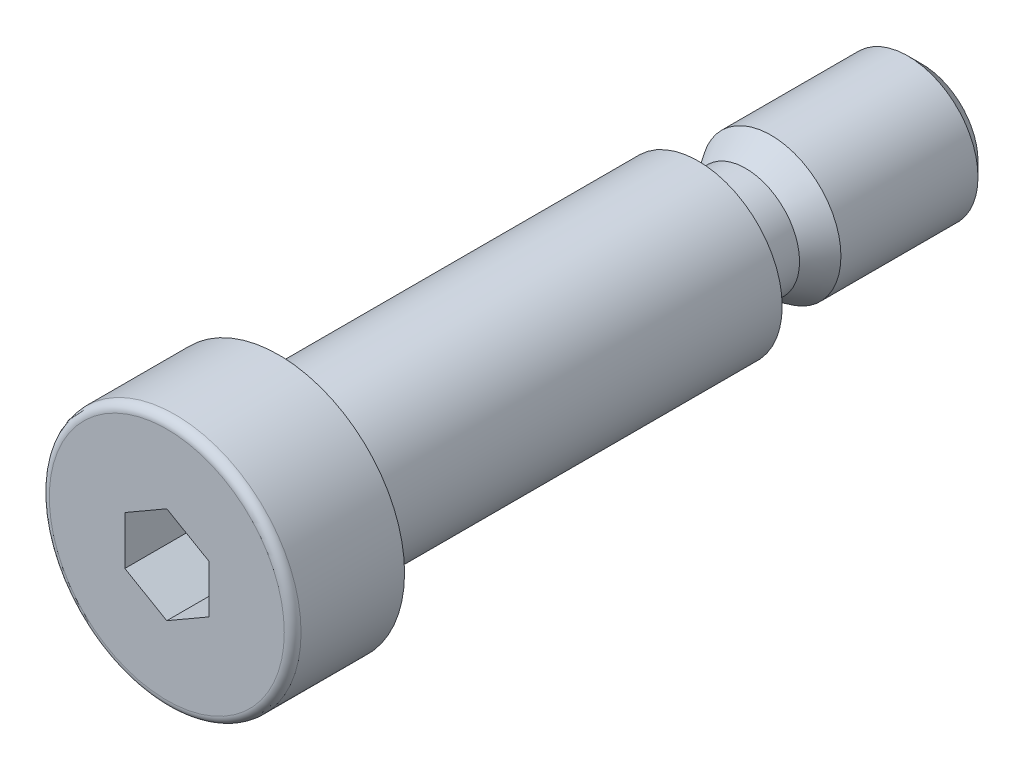
ISO-10303-21;
HEADER;
FILE_DESCRIPTION(('STEP AP214'),'2;1');
FILE_NAME('part.step','',(''),(''),'','','');
FILE_SCHEMA(('AUTOMOTIVE_DESIGN { 1 0 10303 214 1 1 1 1 }'));
ENDSEC;
DATA;
#1=APPLICATION_CONTEXT('core data for automotive mechanical design processes');
#2=APPLICATION_PROTOCOL_DEFINITION('international standard','automotive_design',2000,#1);
#3=PRODUCT_CONTEXT('',#1,'mechanical');
#4=PRODUCT('Part','Part','',(#3));
#5=PRODUCT_RELATED_PRODUCT_CATEGORY('part','',(#4));
#6=PRODUCT_DEFINITION_FORMATION('','',#4);
#7=PRODUCT_DEFINITION_CONTEXT('part definition',#1,'design');
#8=PRODUCT_DEFINITION('design','',#6,#7);
#9=PRODUCT_DEFINITION_SHAPE('','',#8);
#10=(LENGTH_UNIT() NAMED_UNIT(*) SI_UNIT(.MILLI.,.METRE.));
#11=(NAMED_UNIT(*) PLANE_ANGLE_UNIT() SI_UNIT($,.RADIAN.));
#12=(NAMED_UNIT(*) SI_UNIT($,.STERADIAN.) SOLID_ANGLE_UNIT());
#13=UNCERTAINTY_MEASURE_WITH_UNIT(LENGTH_MEASURE(1.E-05),#10,'distance_accuracy_value','');
#14=(GEOMETRIC_REPRESENTATION_CONTEXT(3) GLOBAL_UNCERTAINTY_ASSIGNED_CONTEXT((#13)) GLOBAL_UNIT_ASSIGNED_CONTEXT((#10,
#11,#12)) REPRESENTATION_CONTEXT('',''));
#15=CARTESIAN_POINT('',(0.,0.,0.));
#16=DIRECTION('',(0.,0.,1.));
#17=DIRECTION('',(1.,0.,0.));
#18=AXIS2_PLACEMENT_3D('',#15,#16,#17);
#19=CARTESIAN_POINT('',(0.,0.,23.));
#20=DIRECTION('',(0.,0.,1.));
#21=DIRECTION('',(1.,0.,0.));
#22=AXIS2_PLACEMENT_3D('',#19,#20,#21);
#23=PLANE('',#22);
#24=CARTESIAN_POINT('',(0.,0.,23.));
#25=DIRECTION('',(0.,0.,1.));
#26=DIRECTION('',(1.,0.,0.));
#27=AXIS2_PLACEMENT_3D('',#24,#25,#26);
#28=CIRCLE('',#27,8.4);
#29=CARTESIAN_POINT('',(8.4,0.,23.));
#30=VERTEX_POINT('',#29);
#31=EDGE_CURVE('E42',#30,#30,#28,.T.);
#32=ORIENTED_EDGE('',*,*,#31,.T.);
#33=EDGE_LOOP('',(#32));
#34=FACE_BOUND('',#33,.T.);
#35=DIRECTION('',(0.,1.,0.));
#36=VECTOR('',#35,1.);
#37=CARTESIAN_POINT('',(3.,-1.73205080756888,23.));
#38=LINE('',#37,#36);
#39=CARTESIAN_POINT('',(3.,-1.73205080756888,23.));
#40=VERTEX_POINT('',#39);
#41=CARTESIAN_POINT('',(3.,1.73205080756888,23.));
#42=VERTEX_POINT('',#41);
#43=EDGE_CURVE('E49',#40,#42,#38,.T.);
#44=ORIENTED_EDGE('',*,*,#43,.F.);
#45=DIRECTION('',(0.866025403784439,0.5,0.));
#46=VECTOR('',#45,1.);
#47=CARTESIAN_POINT('',(0.,-3.46410161513775,23.));
#48=LINE('',#47,#46);
#49=CARTESIAN_POINT('',(0.,-3.46410161513775,23.));
#50=VERTEX_POINT('',#49);
#51=EDGE_CURVE('E132',#50,#40,#48,.T.);
#52=ORIENTED_EDGE('',*,*,#51,.F.);
#53=DIRECTION('',(0.866025403784439,-0.5,0.));
#54=VECTOR('',#53,1.);
#55=CARTESIAN_POINT('',(-3.,-1.73205080756888,23.));
#56=LINE('',#55,#54);
#57=CARTESIAN_POINT('',(-3.,-1.73205080756888,23.));
#58=VERTEX_POINT('',#57);
#59=EDGE_CURVE('E130',#58,#50,#56,.T.);
#60=ORIENTED_EDGE('',*,*,#59,.F.);
#61=DIRECTION('',(0.,-1.,0.));
#62=VECTOR('',#61,1.);
#63=CARTESIAN_POINT('',(-3.,1.73205080756888,23.));
#64=LINE('',#63,#62);
#65=CARTESIAN_POINT('',(-3.,1.73205080756888,23.));
#66=VERTEX_POINT('',#65);
#67=EDGE_CURVE('E97',#66,#58,#64,.T.);
#68=ORIENTED_EDGE('',*,*,#67,.F.);
#69=DIRECTION('',(-0.866025403784439,-0.5,0.));
#70=VECTOR('',#69,1.);
#71=CARTESIAN_POINT('',(0.,3.46410161513775,23.));
#72=LINE('',#71,#70);
#73=CARTESIAN_POINT('',(0.,3.46410161513775,23.));
#74=VERTEX_POINT('',#73);
#75=EDGE_CURVE('E126',#74,#66,#72,.T.);
#76=ORIENTED_EDGE('',*,*,#75,.F.);
#77=DIRECTION('',(-0.866025403784439,0.5,0.));
#78=VECTOR('',#77,1.);
#79=CARTESIAN_POINT('',(3.,1.73205080756888,23.));
#80=LINE('',#79,#78);
#81=EDGE_CURVE('E123',#42,#74,#80,.T.);
#82=ORIENTED_EDGE('',*,*,#81,.F.);
#83=EDGE_LOOP('',(#44,#52,#60,#68,#76,#82));
#84=FACE_BOUND('',#83,.T.);
#85=ADVANCED_FACE('F34',(#34,#84),#23,.T.);
#86=CARTESIAN_POINT('',(0.,0.,-31.));
#87=DIRECTION('',(0.,0.,1.));
#88=DIRECTION('',(1.,0.,0.));
#89=AXIS2_PLACEMENT_3D('',#86,#87,#88);
#90=PLANE('',#89);
#91=CARTESIAN_POINT('',(0.,0.,-31.));
#92=DIRECTION('',(0.,0.,1.));
#93=DIRECTION('',(1.,0.,0.));
#94=AXIS2_PLACEMENT_3D('',#91,#92,#93);
#95=CIRCLE('',#94,4.);
#96=CARTESIAN_POINT('',(4.,0.,-31.));
#97=VERTEX_POINT('',#96);
#98=EDGE_CURVE('E162',#97,#97,#95,.T.);
#99=ORIENTED_EDGE('',*,*,#98,.F.);
#100=EDGE_LOOP('',(#99));
#101=FACE_BOUND('',#100,.T.);
#102=ADVANCED_FACE('F178',(#101),#90,.F.);
#103=CARTESIAN_POINT('',(0.,0.,-31.));
#104=DIRECTION('',(0.,0.,1.));
#105=DIRECTION('',(1.,0.,0.));
#106=AXIS2_PLACEMENT_3D('',#103,#104,#105);
#107=CONICAL_SURFACE('',#106,4.,0.785398163397447);
#108=CARTESIAN_POINT('',(0.,0.,-30.));
#109=DIRECTION('',(0.,0.,1.));
#110=DIRECTION('',(1.,0.,0.));
#111=AXIS2_PLACEMENT_3D('',#108,#109,#110);
#112=CIRCLE('',#111,5.);
#113=CARTESIAN_POINT('',(5.,0.,-30.));
#114=VERTEX_POINT('',#113);
#115=EDGE_CURVE('E159',#114,#114,#112,.T.);
#116=ORIENTED_EDGE('',*,*,#115,.F.);
#117=EDGE_LOOP('',(#116));
#118=FACE_BOUND('',#117,.T.);
#119=ORIENTED_EDGE('',*,*,#98,.T.);
#120=EDGE_LOOP('',(#119));
#121=FACE_BOUND('',#120,.T.);
#122=ADVANCED_FACE('F182',(#118,#121),#107,.T.);
#123=CARTESIAN_POINT('',(0.,0.,23.));
#124=DIRECTION('',(0.,0.,1.));
#125=DIRECTION('',(1.,0.,0.));
#126=AXIS2_PLACEMENT_3D('',#123,#124,#125);
#127=CYLINDRICAL_SURFACE('',#126,5.);
#128=CARTESIAN_POINT('',(0.,0.,-20.2));
#129=DIRECTION('',(0.,0.,1.));
#130=DIRECTION('',(1.,0.,0.));
#131=AXIS2_PLACEMENT_3D('',#128,#129,#130);
#132=CIRCLE('',#131,5.);
#133=CARTESIAN_POINT('',(5.,0.,-20.2));
#134=VERTEX_POINT('',#133);
#135=EDGE_CURVE('E156',#134,#134,#132,.T.);
#136=ORIENTED_EDGE('',*,*,#135,.F.);
#137=EDGE_LOOP('',(#136));
#138=FACE_BOUND('',#137,.T.);
#139=ORIENTED_EDGE('',*,*,#115,.T.);
#140=EDGE_LOOP('',(#139));
#141=FACE_BOUND('',#140,.T.);
#142=ADVANCED_FACE('F188',(#138,#141),#127,.T.);
#143=CARTESIAN_POINT('',(0.,0.,-20.2));
#144=DIRECTION('',(0.,0.,-1.));
#145=DIRECTION('',(-1.,0.,0.));
#146=AXIS2_PLACEMENT_3D('',#143,#144,#145);
#147=CONICAL_SURFACE('',#146,5.,0.566013910063243);
#148=CARTESIAN_POINT('',(0.,0.,-18.39));
#149=DIRECTION('',(0.,0.,1.));
#150=DIRECTION('',(1.,0.,0.));
#151=AXIS2_PLACEMENT_3D('',#148,#149,#150);
#152=CIRCLE('',#151,3.85);
#153=CARTESIAN_POINT('',(3.85,0.,-18.39));
#154=VERTEX_POINT('',#153);
#155=EDGE_CURVE('E153',#154,#154,#152,.T.);
#156=ORIENTED_EDGE('',*,*,#155,.F.);
#157=EDGE_LOOP('',(#156));
#158=FACE_BOUND('',#157,.T.);
#159=ORIENTED_EDGE('',*,*,#135,.T.);
#160=EDGE_LOOP('',(#159));
#161=FACE_BOUND('',#160,.T.);
#162=ADVANCED_FACE('F192',(#158,#161),#147,.T.);
#163=CARTESIAN_POINT('',(0.,0.,23.));
#164=DIRECTION('',(0.,0.,1.));
#165=DIRECTION('',(1.,0.,0.));
#166=AXIS2_PLACEMENT_3D('',#163,#164,#165);
#167=CYLINDRICAL_SURFACE('',#166,3.85);
#168=ORIENTED_EDGE('',*,*,#155,.T.);
#169=EDGE_LOOP('',(#168));
#170=FACE_BOUND('',#169,.T.);
#171=CARTESIAN_POINT('',(0.,0.,-15.));
#172=DIRECTION('',(0.,0.,1.));
#173=DIRECTION('',(1.,0.,0.));
#174=AXIS2_PLACEMENT_3D('',#171,#172,#173);
#175=CIRCLE('',#174,3.85);
#176=CARTESIAN_POINT('',(3.85,0.,-15.));
#177=VERTEX_POINT('',#176);
#178=EDGE_CURVE('E150',#177,#177,#175,.T.);
#179=ORIENTED_EDGE('',*,*,#178,.F.);
#180=EDGE_LOOP('',(#179));
#181=FACE_BOUND('',#180,.T.);
#182=ADVANCED_FACE('F196',(#170,#181),#167,.T.);
#183=CARTESIAN_POINT('',(0.,0.,-15.));
#184=DIRECTION('',(0.,0.,1.));
#185=DIRECTION('',(1.,0.,0.));
#186=AXIS2_PLACEMENT_3D('',#183,#184,#185);
#187=PLANE('',#186);
#188=CARTESIAN_POINT('',(0.,0.,-15.));
#189=DIRECTION('',(0.,0.,1.));
#190=DIRECTION('',(1.,0.,0.));
#191=AXIS2_PLACEMENT_3D('',#188,#189,#190);
#192=CIRCLE('',#191,6.);
#193=CARTESIAN_POINT('',(6.,0.,-15.));
#194=VERTEX_POINT('',#193);
#195=EDGE_CURVE('E147',#194,#194,#192,.T.);
#196=ORIENTED_EDGE('',*,*,#195,.F.);
#197=EDGE_LOOP('',(#196));
#198=FACE_BOUND('',#197,.T.);
#199=ORIENTED_EDGE('',*,*,#178,.T.);
#200=EDGE_LOOP('',(#199));
#201=FACE_BOUND('',#200,.T.);
#202=ADVANCED_FACE('F200',(#198,#201),#187,.F.);
#203=CARTESIAN_POINT('',(0.,0.,23.));
#204=DIRECTION('',(0.,0.,1.));
#205=DIRECTION('',(1.,0.,0.));
#206=AXIS2_PLACEMENT_3D('',#203,#204,#205);
#207=CYLINDRICAL_SURFACE('',#206,6.);
#208=ORIENTED_EDGE('',*,*,#195,.T.);
#209=EDGE_LOOP('',(#208));
#210=FACE_BOUND('',#209,.T.);
#211=CARTESIAN_POINT('',(0.,0.,15.));
#212=DIRECTION('',(0.,0.,1.));
#213=DIRECTION('',(1.,0.,0.));
#214=AXIS2_PLACEMENT_3D('',#211,#212,#213);
#215=CIRCLE('',#214,6.);
#216=CARTESIAN_POINT('',(6.,0.,15.));
#217=VERTEX_POINT('',#216);
#218=EDGE_CURVE('E144',#217,#217,#215,.T.);
#219=ORIENTED_EDGE('',*,*,#218,.F.);
#220=EDGE_LOOP('',(#219));
#221=FACE_BOUND('',#220,.T.);
#222=ADVANCED_FACE('F204',(#210,#221),#207,.T.);
#223=CARTESIAN_POINT('',(0.,0.,15.));
#224=DIRECTION('',(0.,0.,1.));
#225=DIRECTION('',(1.,0.,0.));
#226=AXIS2_PLACEMENT_3D('',#223,#224,#225);
#227=PLANE('',#226);
#228=CARTESIAN_POINT('',(0.,0.,15.));
#229=DIRECTION('',(0.,0.,1.));
#230=DIRECTION('',(1.,0.,0.));
#231=AXIS2_PLACEMENT_3D('',#228,#229,#230);
#232=CIRCLE('',#231,9.);
#233=CARTESIAN_POINT('',(9.,0.,15.));
#234=VERTEX_POINT('',#233);
#235=EDGE_CURVE('E136',#234,#234,#232,.T.);
#236=ORIENTED_EDGE('',*,*,#235,.F.);
#237=EDGE_LOOP('',(#236));
#238=FACE_BOUND('',#237,.T.);
#239=ORIENTED_EDGE('',*,*,#218,.T.);
#240=EDGE_LOOP('',(#239));
#241=FACE_BOUND('',#240,.T.);
#242=ADVANCED_FACE('F208',(#238,#241),#227,.F.);
#243=CARTESIAN_POINT('',(0.,0.,23.));
#244=DIRECTION('',(0.,0.,1.));
#245=DIRECTION('',(1.,0.,0.));
#246=AXIS2_PLACEMENT_3D('',#243,#244,#245);
#247=CYLINDRICAL_SURFACE('',#246,9.);
#248=CARTESIAN_POINT('',(0.,0.,22.4));
#249=DIRECTION('',(0.,0.,1.));
#250=DIRECTION('',(1.,0.,0.));
#251=AXIS2_PLACEMENT_3D('',#248,#249,#250);
#252=CIRCLE('',#251,9.);
#253=CARTESIAN_POINT('',(9.,0.,22.4));
#254=VERTEX_POINT('',#253);
#255=EDGE_CURVE('E11',#254,#254,#252,.F.);
#256=ORIENTED_EDGE('',*,*,#255,.T.);
#257=EDGE_LOOP('',(#256));
#258=FACE_BOUND('',#257,.T.);
#259=ORIENTED_EDGE('',*,*,#235,.T.);
#260=EDGE_LOOP('',(#259));
#261=FACE_BOUND('',#260,.T.);
#262=ADVANCED_FACE('F212',(#258,#261),#247,.T.);
#263=CARTESIAN_POINT('',(3.,-1.73205080756888,18.1));
#264=DIRECTION('',(1.,0.,0.));
#265=DIRECTION('',(0.,1.,0.));
#266=AXIS2_PLACEMENT_3D('',#263,#264,#265);
#267=PLANE('',#266);
#268=ORIENTED_EDGE('',*,*,#43,.T.);
#269=DIRECTION('',(0.,0.,1.));
#270=VECTOR('',#269,1.);
#271=CARTESIAN_POINT('',(3.,1.73205080756888,18.1));
#272=LINE('',#271,#270);
#273=CARTESIAN_POINT('',(3.,1.73205080756888,18.1));
#274=VERTEX_POINT('',#273);
#275=EDGE_CURVE('E79',#274,#42,#272,.T.);
#276=ORIENTED_EDGE('',*,*,#275,.F.);
#277=DIRECTION('',(0.,1.,0.));
#278=VECTOR('',#277,1.);
#279=CARTESIAN_POINT('',(3.,-1.73205080756888,18.1));
#280=LINE('',#279,#278);
#281=CARTESIAN_POINT('',(3.,-1.73205080756888,18.1));
#282=VERTEX_POINT('',#281);
#283=EDGE_CURVE('E134',#282,#274,#280,.T.);
#284=ORIENTED_EDGE('',*,*,#283,.F.);
#285=DIRECTION('',(0.,0.,1.));
#286=VECTOR('',#285,1.);
#287=CARTESIAN_POINT('',(3.,-1.73205080756888,18.1));
#288=LINE('',#287,#286);
#289=EDGE_CURVE('E57',#282,#40,#288,.T.);
#290=ORIENTED_EDGE('',*,*,#289,.T.);
#291=EDGE_LOOP('',(#268,#276,#284,#290));
#292=FACE_BOUND('',#291,.T.);
#293=ADVANCED_FACE('F216',(#292),#267,.F.);
#294=CARTESIAN_POINT('',(0.,-3.46410161513775,18.1));
#295=DIRECTION('',(0.5,-0.866025403784439,0.));
#296=DIRECTION('',(0.866025403784439,0.5,0.));
#297=AXIS2_PLACEMENT_3D('',#294,#295,#296);
#298=PLANE('',#297);
#299=ORIENTED_EDGE('',*,*,#51,.T.);
#300=ORIENTED_EDGE('',*,*,#289,.F.);
#301=DIRECTION('',(0.866025403784439,0.5,0.));
#302=VECTOR('',#301,1.);
#303=CARTESIAN_POINT('',(0.,-3.46410161513775,18.1));
#304=LINE('',#303,#302);
#305=CARTESIAN_POINT('',(0.,-3.46410161513775,18.1));
#306=VERTEX_POINT('',#305);
#307=EDGE_CURVE('E109',#306,#282,#304,.T.);
#308=ORIENTED_EDGE('',*,*,#307,.F.);
#309=DIRECTION('',(0.,0.,1.));
#310=VECTOR('',#309,1.);
#311=CARTESIAN_POINT('',(0.,-3.46410161513775,18.1));
#312=LINE('',#311,#310);
#313=EDGE_CURVE('E101',#306,#50,#312,.T.);
#314=ORIENTED_EDGE('',*,*,#313,.T.);
#315=EDGE_LOOP('',(#299,#300,#308,#314));
#316=FACE_BOUND('',#315,.T.);
#317=ADVANCED_FACE('F220',(#316),#298,.F.);
#318=CARTESIAN_POINT('',(-3.,-1.73205080756888,18.1));
#319=DIRECTION('',(-0.5,-0.866025403784439,0.));
#320=DIRECTION('',(0.866025403784439,-0.5,0.));
#321=AXIS2_PLACEMENT_3D('',#318,#319,#320);
#322=PLANE('',#321);
#323=ORIENTED_EDGE('',*,*,#59,.T.);
#324=ORIENTED_EDGE('',*,*,#313,.F.);
#325=DIRECTION('',(0.866025403784439,-0.5,0.));
#326=VECTOR('',#325,1.);
#327=CARTESIAN_POINT('',(-3.,-1.73205080756888,18.1));
#328=LINE('',#327,#326);
#329=CARTESIAN_POINT('',(-3.,-1.73205080756888,18.1));
#330=VERTEX_POINT('',#329);
#331=EDGE_CURVE('E105',#330,#306,#328,.T.);
#332=ORIENTED_EDGE('',*,*,#331,.F.);
#333=DIRECTION('',(0.,0.,1.));
#334=VECTOR('',#333,1.);
#335=CARTESIAN_POINT('',(-3.,-1.73205080756888,18.1));
#336=LINE('',#335,#334);
#337=EDGE_CURVE('E90',#330,#58,#336,.T.);
#338=ORIENTED_EDGE('',*,*,#337,.T.);
#339=EDGE_LOOP('',(#323,#324,#332,#338));
#340=FACE_BOUND('',#339,.T.);
#341=ADVANCED_FACE('F106',(#340),#322,.F.);
#342=CARTESIAN_POINT('',(-3.,1.73205080756888,18.1));
#343=DIRECTION('',(-1.,0.,0.));
#344=DIRECTION('',(0.,0.,1.));
#345=AXIS2_PLACEMENT_3D('',#342,#343,#344);
#346=PLANE('',#345);
#347=ORIENTED_EDGE('',*,*,#67,.T.);
#348=ORIENTED_EDGE('',*,*,#337,.F.);
#349=DIRECTION('',(0.,-1.,0.));
#350=VECTOR('',#349,1.);
#351=CARTESIAN_POINT('',(-3.,1.73205080756888,18.1));
#352=LINE('',#351,#350);
#353=CARTESIAN_POINT('',(-3.,1.73205080756888,18.1));
#354=VERTEX_POINT('',#353);
#355=EDGE_CURVE('E94',#354,#330,#352,.T.);
#356=ORIENTED_EDGE('',*,*,#355,.F.);
#357=DIRECTION('',(0.,0.,1.));
#358=VECTOR('',#357,1.);
#359=CARTESIAN_POINT('',(-3.,1.73205080756888,18.1));
#360=LINE('',#359,#358);
#361=EDGE_CURVE('E102',#354,#66,#360,.T.);
#362=ORIENTED_EDGE('',*,*,#361,.T.);
#363=EDGE_LOOP('',(#347,#348,#356,#362));
#364=FACE_BOUND('',#363,.T.);
#365=ADVANCED_FACE('F92',(#364),#346,.F.);
#366=CARTESIAN_POINT('',(0.,3.46410161513775,18.1));
#367=DIRECTION('',(-0.5,0.866025403784439,0.));
#368=DIRECTION('',(-0.866025403784439,-0.5,0.));
#369=AXIS2_PLACEMENT_3D('',#366,#367,#368);
#370=PLANE('',#369);
#371=ORIENTED_EDGE('',*,*,#75,.T.);
#372=ORIENTED_EDGE('',*,*,#361,.F.);
#373=DIRECTION('',(-0.866025403784439,-0.5,0.));
#374=VECTOR('',#373,1.);
#375=CARTESIAN_POINT('',(0.,3.46410161513775,18.1));
#376=LINE('',#375,#374);
#377=CARTESIAN_POINT('',(0.,3.46410161513775,18.1));
#378=VERTEX_POINT('',#377);
#379=EDGE_CURVE('E115',#378,#354,#376,.T.);
#380=ORIENTED_EDGE('',*,*,#379,.F.);
#381=DIRECTION('',(0.,0.,1.));
#382=VECTOR('',#381,1.);
#383=CARTESIAN_POINT('',(0.,3.46410161513775,18.1));
#384=LINE('',#383,#382);
#385=EDGE_CURVE('E139',#378,#74,#384,.T.);
#386=ORIENTED_EDGE('',*,*,#385,.T.);
#387=EDGE_LOOP('',(#371,#372,#380,#386));
#388=FACE_BOUND('',#387,.T.);
#389=ADVANCED_FACE('F223',(#388),#370,.F.);
#390=CARTESIAN_POINT('',(3.,1.73205080756888,18.1));
#391=DIRECTION('',(0.5,0.866025403784439,0.));
#392=DIRECTION('',(-0.866025403784439,0.5,0.));
#393=AXIS2_PLACEMENT_3D('',#390,#391,#392);
#394=PLANE('',#393);
#395=ORIENTED_EDGE('',*,*,#81,.T.);
#396=ORIENTED_EDGE('',*,*,#385,.F.);
#397=DIRECTION('',(-0.866025403784439,0.5,0.));
#398=VECTOR('',#397,1.);
#399=CARTESIAN_POINT('',(3.,1.73205080756888,18.1));
#400=LINE('',#399,#398);
#401=EDGE_CURVE('E117',#274,#378,#400,.T.);
#402=ORIENTED_EDGE('',*,*,#401,.F.);
#403=ORIENTED_EDGE('',*,*,#275,.T.);
#404=EDGE_LOOP('',(#395,#396,#402,#403));
#405=FACE_BOUND('',#404,.T.);
#406=ADVANCED_FACE('F174',(#405),#394,.F.);
#407=CARTESIAN_POINT('',(0.,0.,18.1));
#408=DIRECTION('',(0.,0.,1.));
#409=DIRECTION('',(1.,0.,0.));
#410=AXIS2_PLACEMENT_3D('',#407,#408,#409);
#411=PLANE('',#410);
#412=ORIENTED_EDGE('',*,*,#283,.T.);
#413=ORIENTED_EDGE('',*,*,#401,.T.);
#414=ORIENTED_EDGE('',*,*,#379,.T.);
#415=ORIENTED_EDGE('',*,*,#355,.T.);
#416=ORIENTED_EDGE('',*,*,#331,.T.);
#417=ORIENTED_EDGE('',*,*,#307,.T.);
#418=EDGE_LOOP('',(#412,#413,#414,#415,#416,#417));
#419=FACE_BOUND('',#418,.T.);
#420=ADVANCED_FACE('F112',(#419),#411,.T.);
#421=CARTESIAN_POINT('',(0.,0.,22.4));
#422=DIRECTION('',(0.,0.,1.));
#423=DIRECTION('',(1.,0.,0.));
#424=AXIS2_PLACEMENT_3D('',#421,#422,#423);
#425=TOROIDAL_SURFACE('',#424,8.4,0.6);
#426=ORIENTED_EDGE('',*,*,#255,.F.);
#427=EDGE_LOOP('',(#426));
#428=FACE_BOUND('',#427,.T.);
#429=ORIENTED_EDGE('',*,*,#31,.F.);
#430=EDGE_LOOP('',(#429));
#431=FACE_BOUND('',#430,.T.);
#432=ADVANCED_FACE('F36',(#428,#431),#425,.T.);
#433=CLOSED_SHELL('',(#85,#102,#122,#142,#162,#182,#202,#222,#242,#262,#293,#317,#341,#365,#389,
#406,#420,#432));
#434=MANIFOLD_SOLID_BREP('B2',#433);
#435=ADVANCED_BREP_SHAPE_REPRESENTATION('',(#18,#434),#14);
#436=SHAPE_DEFINITION_REPRESENTATION(#9,#435);
ENDSEC;
END-ISO-10303-21;
